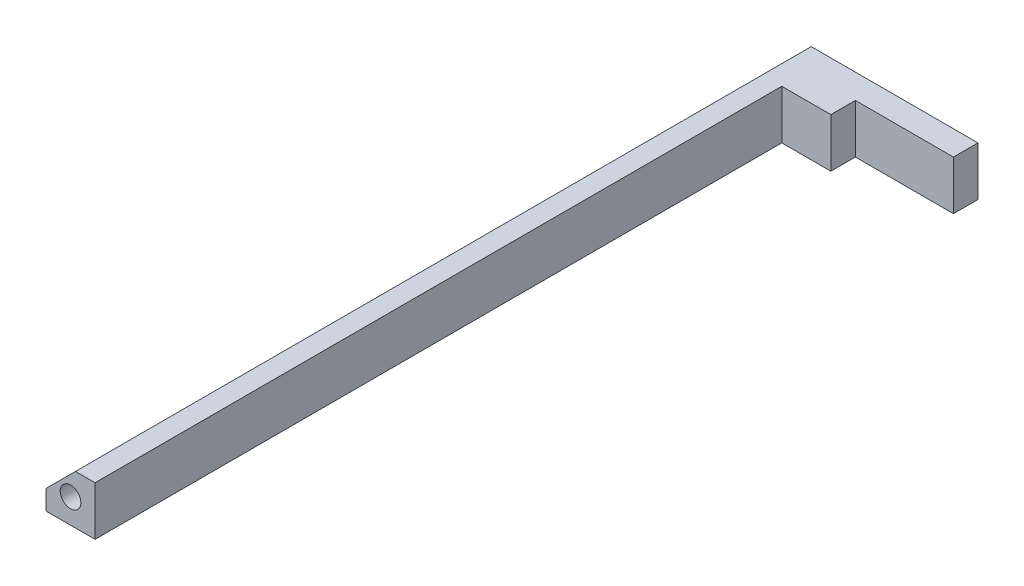
ISO-10303-21;
HEADER;
FILE_DESCRIPTION(('STEP AP214'),'2;1');
FILE_NAME('part.step','',(''),(''),'','','');
FILE_SCHEMA(('AUTOMOTIVE_DESIGN { 1 0 10303 214 1 1 1 1 }'));
ENDSEC;
DATA;
#1=APPLICATION_CONTEXT('core data for automotive mechanical design processes');
#2=APPLICATION_PROTOCOL_DEFINITION('international standard','automotive_design',2000,#1);
#3=PRODUCT_CONTEXT('',#1,'mechanical');
#4=PRODUCT('Part','Part','',(#3));
#5=PRODUCT_RELATED_PRODUCT_CATEGORY('part','',(#4));
#6=PRODUCT_DEFINITION_FORMATION('','',#4);
#7=PRODUCT_DEFINITION_CONTEXT('part definition',#1,'design');
#8=PRODUCT_DEFINITION('design','',#6,#7);
#9=PRODUCT_DEFINITION_SHAPE('','',#8);
#10=(LENGTH_UNIT() NAMED_UNIT(*) SI_UNIT(.MILLI.,.METRE.));
#11=(NAMED_UNIT(*) PLANE_ANGLE_UNIT() SI_UNIT($,.RADIAN.));
#12=(NAMED_UNIT(*) SI_UNIT($,.STERADIAN.) SOLID_ANGLE_UNIT());
#13=UNCERTAINTY_MEASURE_WITH_UNIT(LENGTH_MEASURE(1.E-05),#10,'distance_accuracy_value','');
#14=(GEOMETRIC_REPRESENTATION_CONTEXT(3) GLOBAL_UNCERTAINTY_ASSIGNED_CONTEXT((#13)) GLOBAL_UNIT_ASSIGNED_CONTEXT((#10,
#11,#12)) REPRESENTATION_CONTEXT('',''));
#15=CARTESIAN_POINT('',(0.,0.,0.));
#16=DIRECTION('',(0.,0.,1.));
#17=DIRECTION('',(1.,0.,0.));
#18=AXIS2_PLACEMENT_3D('',#15,#16,#17);
#19=CARTESIAN_POINT('',(10.,10.,0.));
#20=DIRECTION('',(0.,0.,-1.));
#21=DIRECTION('',(-1.,0.,0.));
#22=AXIS2_PLACEMENT_3D('',#19,#20,#21);
#23=PLANE('',#22);
#24=CARTESIAN_POINT('',(5.,5.,0.));
#25=DIRECTION('',(0.,0.,1.));
#26=DIRECTION('',(1.,0.,0.));
#27=AXIS2_PLACEMENT_3D('',#24,#25,#26);
#28=CIRCLE('',#27,2.1);
#29=CARTESIAN_POINT('',(7.1,5.,0.));
#30=VERTEX_POINT('',#29);
#31=EDGE_CURVE('E192',#30,#30,#28,.T.);
#32=ORIENTED_EDGE('',*,*,#31,.F.);
#33=EDGE_LOOP('',(#32));
#34=FACE_BOUND('',#33,.T.);
#35=DIRECTION('',(1.,0.,0.));
#36=VECTOR('',#35,1.);
#37=CARTESIAN_POINT('',(10.,10.,0.));
#38=LINE('',#37,#36);
#39=CARTESIAN_POINT('',(6.00000000000001,10.,0.));
#40=VERTEX_POINT('',#39);
#41=CARTESIAN_POINT('',(10.,10.,0.));
#42=VERTEX_POINT('',#41);
#43=EDGE_CURVE('E110',#40,#42,#38,.T.);
#44=ORIENTED_EDGE('',*,*,#43,.F.);
#45=DIRECTION('',(0.707106781186546,0.707106781186549,0.));
#46=VECTOR('',#45,1.);
#47=CARTESIAN_POINT('',(6.00000000000001,10.,0.));
#48=LINE('',#47,#46);
#49=CARTESIAN_POINT('',(0.,3.99999999999997,0.));
#50=VERTEX_POINT('',#49);
#51=EDGE_CURVE('E64',#40,#50,#48,.F.);
#52=ORIENTED_EDGE('',*,*,#51,.T.);
#53=DIRECTION('',(0.,-1.,0.));
#54=VECTOR('',#53,1.);
#55=CARTESIAN_POINT('',(0.,10.,0.));
#56=LINE('',#55,#54);
#57=CARTESIAN_POINT('',(0.,0.,0.));
#58=VERTEX_POINT('',#57);
#59=EDGE_CURVE('E152',#50,#58,#56,.T.);
#60=ORIENTED_EDGE('',*,*,#59,.T.);
#61=DIRECTION('',(1.,0.,0.));
#62=VECTOR('',#61,1.);
#63=CARTESIAN_POINT('',(10.,0.,0.));
#64=LINE('',#63,#62);
#65=CARTESIAN_POINT('',(10.,0.,0.));
#66=VERTEX_POINT('',#65);
#67=EDGE_CURVE('E132',#58,#66,#64,.T.);
#68=ORIENTED_EDGE('',*,*,#67,.T.);
#69=DIRECTION('',(0.,-1.,0.));
#70=VECTOR('',#69,1.);
#71=CARTESIAN_POINT('',(10.,10.,0.));
#72=LINE('',#71,#70);
#73=EDGE_CURVE('E124',#42,#66,#72,.T.);
#74=ORIENTED_EDGE('',*,*,#73,.F.);
#75=EDGE_LOOP('',(#44,#52,#60,#68,#74));
#76=FACE_BOUND('',#75,.T.);
#77=ADVANCED_FACE('F41',(#34,#76),#23,.F.);
#78=CARTESIAN_POINT('',(9.99999999999998,10.,-140.));
#79=DIRECTION('',(-1.,0.,0.));
#80=DIRECTION('',(0.,0.,1.));
#81=AXIS2_PLACEMENT_3D('',#78,#79,#80);
#82=PLANE('',#81);
#83=DIRECTION('',(0.,0.,-1.));
#84=VECTOR('',#83,1.);
#85=CARTESIAN_POINT('',(9.99999999999998,0.,-140.));
#86=LINE('',#85,#84);
#87=CARTESIAN_POINT('',(9.99999999999998,0.,-140.));
#88=VERTEX_POINT('',#87);
#89=EDGE_CURVE('E168',#66,#88,#86,.T.);
#90=ORIENTED_EDGE('',*,*,#89,.T.);
#91=DIRECTION('',(0.,-1.,0.));
#92=VECTOR('',#91,1.);
#93=CARTESIAN_POINT('',(9.99999999999998,10.,-140.));
#94=LINE('',#93,#92);
#95=CARTESIAN_POINT('',(9.99999999999998,10.,-140.));
#96=VERTEX_POINT('',#95);
#97=EDGE_CURVE('E127',#96,#88,#94,.T.);
#98=ORIENTED_EDGE('',*,*,#97,.F.);
#99=DIRECTION('',(0.,0.,-1.));
#100=VECTOR('',#99,1.);
#101=CARTESIAN_POINT('',(9.99999999999998,10.,-140.));
#102=LINE('',#101,#100);
#103=EDGE_CURVE('E114',#42,#96,#102,.T.);
#104=ORIENTED_EDGE('',*,*,#103,.F.);
#105=ORIENTED_EDGE('',*,*,#73,.T.);
#106=EDGE_LOOP('',(#90,#98,#104,#105));
#107=FACE_BOUND('',#106,.T.);
#108=ADVANCED_FACE('F123',(#107),#82,.F.);
#109=CARTESIAN_POINT('',(20.,10.,-140.));
#110=DIRECTION('',(0.,0.,-1.));
#111=DIRECTION('',(-1.,0.,0.));
#112=AXIS2_PLACEMENT_3D('',#109,#110,#111);
#113=PLANE('',#112);
#114=DIRECTION('',(1.,0.,0.));
#115=VECTOR('',#114,1.);
#116=CARTESIAN_POINT('',(20.,0.,-140.));
#117=LINE('',#116,#115);
#118=CARTESIAN_POINT('',(20.,0.,-140.));
#119=VERTEX_POINT('',#118);
#120=EDGE_CURVE('E166',#88,#119,#117,.T.);
#121=ORIENTED_EDGE('',*,*,#120,.T.);
#122=DIRECTION('',(0.,-1.,0.));
#123=VECTOR('',#122,1.);
#124=CARTESIAN_POINT('',(20.,10.,-140.));
#125=LINE('',#124,#123);
#126=CARTESIAN_POINT('',(20.,10.,-140.));
#127=VERTEX_POINT('',#126);
#128=EDGE_CURVE('E135',#127,#119,#125,.T.);
#129=ORIENTED_EDGE('',*,*,#128,.F.);
#130=DIRECTION('',(1.,0.,0.));
#131=VECTOR('',#130,1.);
#132=CARTESIAN_POINT('',(20.,10.,-140.));
#133=LINE('',#132,#131);
#134=EDGE_CURVE('E129',#96,#127,#133,.T.);
#135=ORIENTED_EDGE('',*,*,#134,.F.);
#136=ORIENTED_EDGE('',*,*,#97,.T.);
#137=EDGE_LOOP('',(#121,#129,#135,#136));
#138=FACE_BOUND('',#137,.T.);
#139=ADVANCED_FACE('F211',(#138),#113,.F.);
#140=CARTESIAN_POINT('',(20.,10.,-145.));
#141=DIRECTION('',(-1.,0.,0.));
#142=DIRECTION('',(0.,0.,1.));
#143=AXIS2_PLACEMENT_3D('',#140,#141,#142);
#144=PLANE('',#143);
#145=DIRECTION('',(0.,0.,-1.));
#146=VECTOR('',#145,1.);
#147=CARTESIAN_POINT('',(20.,0.,-145.));
#148=LINE('',#147,#146);
#149=CARTESIAN_POINT('',(20.,0.,-145.));
#150=VERTEX_POINT('',#149);
#151=EDGE_CURVE('E164',#119,#150,#148,.T.);
#152=ORIENTED_EDGE('',*,*,#151,.T.);
#153=DIRECTION('',(0.,-1.,0.));
#154=VECTOR('',#153,1.);
#155=CARTESIAN_POINT('',(20.,10.,-145.));
#156=LINE('',#155,#154);
#157=CARTESIAN_POINT('',(20.,10.,-145.));
#158=VERTEX_POINT('',#157);
#159=EDGE_CURVE('E141',#158,#150,#156,.T.);
#160=ORIENTED_EDGE('',*,*,#159,.F.);
#161=DIRECTION('',(0.,0.,-1.));
#162=VECTOR('',#161,1.);
#163=CARTESIAN_POINT('',(20.,10.,-145.));
#164=LINE('',#163,#162);
#165=EDGE_CURVE('E177',#127,#158,#164,.T.);
#166=ORIENTED_EDGE('',*,*,#165,.F.);
#167=ORIENTED_EDGE('',*,*,#128,.T.);
#168=EDGE_LOOP('',(#152,#160,#166,#167));
#169=FACE_BOUND('',#168,.T.);
#170=ADVANCED_FACE('F216',(#169),#144,.F.);
#171=CARTESIAN_POINT('',(40.,10.,-145.));
#172=DIRECTION('',(0.,0.,-1.));
#173=DIRECTION('',(-1.,0.,0.));
#174=AXIS2_PLACEMENT_3D('',#171,#172,#173);
#175=PLANE('',#174);
#176=DIRECTION('',(1.,0.,0.));
#177=VECTOR('',#176,1.);
#178=CARTESIAN_POINT('',(40.,0.,-145.));
#179=LINE('',#178,#177);
#180=CARTESIAN_POINT('',(40.,0.,-145.));
#181=VERTEX_POINT('',#180);
#182=EDGE_CURVE('E162',#150,#181,#179,.T.);
#183=ORIENTED_EDGE('',*,*,#182,.T.);
#184=DIRECTION('',(0.,-1.,0.));
#185=VECTOR('',#184,1.);
#186=CARTESIAN_POINT('',(40.,10.,-145.));
#187=LINE('',#186,#185);
#188=CARTESIAN_POINT('',(40.,10.,-145.));
#189=VERTEX_POINT('',#188);
#190=EDGE_CURVE('E144',#189,#181,#187,.T.);
#191=ORIENTED_EDGE('',*,*,#190,.F.);
#192=DIRECTION('',(1.,0.,0.));
#193=VECTOR('',#192,1.);
#194=CARTESIAN_POINT('',(40.,10.,-145.));
#195=LINE('',#194,#193);
#196=EDGE_CURVE('E175',#158,#189,#195,.T.);
#197=ORIENTED_EDGE('',*,*,#196,.F.);
#198=ORIENTED_EDGE('',*,*,#159,.T.);
#199=EDGE_LOOP('',(#183,#191,#197,#198));
#200=FACE_BOUND('',#199,.T.);
#201=ADVANCED_FACE('F220',(#200),#175,.F.);
#202=CARTESIAN_POINT('',(40.,10.,-150.));
#203=DIRECTION('',(-1.,0.,0.));
#204=DIRECTION('',(0.,0.,1.));
#205=AXIS2_PLACEMENT_3D('',#202,#203,#204);
#206=PLANE('',#205);
#207=DIRECTION('',(0.,0.,-1.));
#208=VECTOR('',#207,1.);
#209=CARTESIAN_POINT('',(40.,0.,-150.));
#210=LINE('',#209,#208);
#211=CARTESIAN_POINT('',(40.,0.,-150.));
#212=VERTEX_POINT('',#211);
#213=EDGE_CURVE('E160',#181,#212,#210,.T.);
#214=ORIENTED_EDGE('',*,*,#213,.T.);
#215=DIRECTION('',(0.,-1.,0.));
#216=VECTOR('',#215,1.);
#217=CARTESIAN_POINT('',(40.,10.,-150.));
#218=LINE('',#217,#216);
#219=CARTESIAN_POINT('',(40.,10.,-150.));
#220=VERTEX_POINT('',#219);
#221=EDGE_CURVE('E147',#220,#212,#218,.T.);
#222=ORIENTED_EDGE('',*,*,#221,.F.);
#223=DIRECTION('',(0.,0.,-1.));
#224=VECTOR('',#223,1.);
#225=CARTESIAN_POINT('',(40.,10.,-150.));
#226=LINE('',#225,#224);
#227=EDGE_CURVE('E173',#189,#220,#226,.T.);
#228=ORIENTED_EDGE('',*,*,#227,.F.);
#229=ORIENTED_EDGE('',*,*,#190,.T.);
#230=EDGE_LOOP('',(#214,#222,#228,#229));
#231=FACE_BOUND('',#230,.T.);
#232=ADVANCED_FACE('F224',(#231),#206,.F.);
#233=CARTESIAN_POINT('',(0.,10.,-150.));
#234=DIRECTION('',(0.,0.,1.));
#235=DIRECTION('',(1.,0.,0.));
#236=AXIS2_PLACEMENT_3D('',#233,#234,#235);
#237=PLANE('',#236);
#238=DIRECTION('',(0.,-1.,0.));
#239=VECTOR('',#238,1.);
#240=CARTESIAN_POINT('',(0.,10.,-150.));
#241=LINE('',#240,#239);
#242=CARTESIAN_POINT('',(0.,3.99999999999997,-150.));
#243=VERTEX_POINT('',#242);
#244=CARTESIAN_POINT('',(0.,0.,-150.));
#245=VERTEX_POINT('',#244);
#246=EDGE_CURVE('E150',#243,#245,#241,.T.);
#247=ORIENTED_EDGE('',*,*,#246,.F.);
#248=DIRECTION('',(-0.707106781186546,-0.707106781186549,0.));
#249=VECTOR('',#248,1.);
#250=CARTESIAN_POINT('',(6.00000000000001,10.,-150.));
#251=LINE('',#250,#249);
#252=CARTESIAN_POINT('',(6.00000000000001,10.,-150.));
#253=VERTEX_POINT('',#252);
#254=EDGE_CURVE('E11',#243,#253,#251,.F.);
#255=ORIENTED_EDGE('',*,*,#254,.T.);
#256=DIRECTION('',(-1.,0.,0.));
#257=VECTOR('',#256,1.);
#258=CARTESIAN_POINT('',(0.,10.,-150.));
#259=LINE('',#258,#257);
#260=EDGE_CURVE('E154',#220,#253,#259,.T.);
#261=ORIENTED_EDGE('',*,*,#260,.F.);
#262=ORIENTED_EDGE('',*,*,#221,.T.);
#263=DIRECTION('',(-1.,0.,0.));
#264=VECTOR('',#263,1.);
#265=CARTESIAN_POINT('',(0.,0.,-150.));
#266=LINE('',#265,#264);
#267=EDGE_CURVE('E157',#212,#245,#266,.T.);
#268=ORIENTED_EDGE('',*,*,#267,.T.);
#269=EDGE_LOOP('',(#247,#255,#261,#262,#268));
#270=FACE_BOUND('',#269,.T.);
#271=ADVANCED_FACE('F228',(#270),#237,.F.);
#272=CARTESIAN_POINT('',(0.,10.,0.));
#273=DIRECTION('',(1.,0.,0.));
#274=DIRECTION('',(0.,0.,-1.));
#275=AXIS2_PLACEMENT_3D('',#272,#273,#274);
#276=PLANE('',#275);
#277=ORIENTED_EDGE('',*,*,#59,.F.);
#278=DIRECTION('',(0.,0.,-1.));
#279=VECTOR('',#278,1.);
#280=CARTESIAN_POINT('',(0.,3.99999999999997,0.));
#281=LINE('',#280,#279);
#282=EDGE_CURVE('E50',#50,#243,#281,.T.);
#283=ORIENTED_EDGE('',*,*,#282,.T.);
#284=ORIENTED_EDGE('',*,*,#246,.T.);
#285=DIRECTION('',(0.,0.,1.));
#286=VECTOR('',#285,1.);
#287=CARTESIAN_POINT('',(0.,0.,0.));
#288=LINE('',#287,#286);
#289=EDGE_CURVE('E119',#245,#58,#288,.T.);
#290=ORIENTED_EDGE('',*,*,#289,.T.);
#291=EDGE_LOOP('',(#277,#283,#284,#290));
#292=FACE_BOUND('',#291,.T.);
#293=ADVANCED_FACE('F232',(#292),#276,.F.);
#294=CARTESIAN_POINT('',(0.,10.,0.));
#295=DIRECTION('',(0.,-1.,0.));
#296=DIRECTION('',(0.,0.,-1.));
#297=AXIS2_PLACEMENT_3D('',#294,#295,#296);
#298=PLANE('',#297);
#299=ORIENTED_EDGE('',*,*,#260,.T.);
#300=DIRECTION('',(0.,0.,1.));
#301=VECTOR('',#300,1.);
#302=CARTESIAN_POINT('',(6.00000000000001,10.,0.));
#303=LINE('',#302,#301);
#304=EDGE_CURVE('E117',#253,#40,#303,.T.);
#305=ORIENTED_EDGE('',*,*,#304,.T.);
#306=ORIENTED_EDGE('',*,*,#43,.T.);
#307=ORIENTED_EDGE('',*,*,#103,.T.);
#308=ORIENTED_EDGE('',*,*,#134,.T.);
#309=ORIENTED_EDGE('',*,*,#165,.T.);
#310=ORIENTED_EDGE('',*,*,#196,.T.);
#311=ORIENTED_EDGE('',*,*,#227,.T.);
#312=EDGE_LOOP('',(#299,#305,#306,#307,#308,#309,#310,#311));
#313=FACE_BOUND('',#312,.T.);
#314=ADVANCED_FACE('F113',(#313),#298,.F.);
#315=CARTESIAN_POINT('',(0.,0.,0.));
#316=DIRECTION('',(0.,-1.,0.));
#317=DIRECTION('',(0.,0.,-1.));
#318=AXIS2_PLACEMENT_3D('',#315,#316,#317);
#319=PLANE('',#318);
#320=CARTESIAN_POINT('',(7.2,0.,-27.));
#321=DIRECTION('',(0.,-1.,0.));
#322=DIRECTION('',(0.,0.,-1.));
#323=AXIS2_PLACEMENT_3D('',#320,#321,#322);
#324=CIRCLE('',#323,2.1);
#325=CARTESIAN_POINT('',(7.2,0.,-29.1));
#326=VERTEX_POINT('',#325);
#327=EDGE_CURVE('E187',#326,#326,#324,.T.);
#328=ORIENTED_EDGE('',*,*,#327,.F.);
#329=EDGE_LOOP('',(#328));
#330=FACE_BOUND('',#329,.T.);
#331=CARTESIAN_POINT('',(7.20000000000002,0.,-123.));
#332=DIRECTION('',(0.,-1.,0.));
#333=DIRECTION('',(0.,0.,-1.));
#334=AXIS2_PLACEMENT_3D('',#331,#332,#333);
#335=CIRCLE('',#334,2.1);
#336=CARTESIAN_POINT('',(7.20000000000002,0.,-125.1));
#337=VERTEX_POINT('',#336);
#338=EDGE_CURVE('E180',#337,#337,#335,.T.);
#339=ORIENTED_EDGE('',*,*,#338,.F.);
#340=EDGE_LOOP('',(#339));
#341=FACE_BOUND('',#340,.T.);
#342=ORIENTED_EDGE('',*,*,#67,.F.);
#343=ORIENTED_EDGE('',*,*,#289,.F.);
#344=ORIENTED_EDGE('',*,*,#267,.F.);
#345=ORIENTED_EDGE('',*,*,#213,.F.);
#346=ORIENTED_EDGE('',*,*,#182,.F.);
#347=ORIENTED_EDGE('',*,*,#151,.F.);
#348=ORIENTED_EDGE('',*,*,#120,.F.);
#349=ORIENTED_EDGE('',*,*,#89,.F.);
#350=EDGE_LOOP('',(#342,#343,#344,#345,#346,#347,#348,#349));
#351=FACE_BOUND('',#350,.T.);
#352=ADVANCED_FACE('F236',(#330,#341,#351),#319,.T.);
#353=CARTESIAN_POINT('',(7.20000000000002,4.,-123.));
#354=DIRECTION('',(0.,-1.,0.));
#355=DIRECTION('',(0.,0.,-1.));
#356=AXIS2_PLACEMENT_3D('',#353,#354,#355);
#357=CYLINDRICAL_SURFACE('',#356,2.1);
#358=CARTESIAN_POINT('',(7.20000000000002,4.,-123.));
#359=DIRECTION('',(0.,-1.,0.));
#360=DIRECTION('',(0.,0.,-1.));
#361=AXIS2_PLACEMENT_3D('',#358,#359,#360);
#362=CIRCLE('',#361,2.1);
#363=CARTESIAN_POINT('',(7.20000000000002,4.,-125.1));
#364=VERTEX_POINT('',#363);
#365=EDGE_CURVE('E183',#364,#364,#362,.T.);
#366=ORIENTED_EDGE('',*,*,#365,.F.);
#367=EDGE_LOOP('',(#366));
#368=FACE_BOUND('',#367,.T.);
#369=ORIENTED_EDGE('',*,*,#338,.T.);
#370=EDGE_LOOP('',(#369));
#371=FACE_BOUND('',#370,.T.);
#372=ADVANCED_FACE('F239',(#368,#371),#357,.F.);
#373=CARTESIAN_POINT('',(7.20000000000002,4.,-123.));
#374=DIRECTION('',(0.,-1.,0.));
#375=DIRECTION('',(0.,0.,-1.));
#376=AXIS2_PLACEMENT_3D('',#373,#374,#375);
#377=PLANE('',#376);
#378=ORIENTED_EDGE('',*,*,#365,.T.);
#379=EDGE_LOOP('',(#378));
#380=FACE_BOUND('',#379,.T.);
#381=ADVANCED_FACE('F245',(#380),#377,.T.);
#382=CARTESIAN_POINT('',(7.2,4.,-27.));
#383=DIRECTION('',(0.,-1.,0.));
#384=DIRECTION('',(0.,0.,-1.));
#385=AXIS2_PLACEMENT_3D('',#382,#383,#384);
#386=CYLINDRICAL_SURFACE('',#385,2.1);
#387=CARTESIAN_POINT('',(7.2,4.,-27.));
#388=DIRECTION('',(0.,-1.,0.));
#389=DIRECTION('',(0.,0.,-1.));
#390=AXIS2_PLACEMENT_3D('',#387,#388,#389);
#391=CIRCLE('',#390,2.1);
#392=CARTESIAN_POINT('',(7.2,4.,-29.1));
#393=VERTEX_POINT('',#392);
#394=EDGE_CURVE('E171',#393,#393,#391,.T.);
#395=ORIENTED_EDGE('',*,*,#394,.F.);
#396=EDGE_LOOP('',(#395));
#397=FACE_BOUND('',#396,.T.);
#398=ORIENTED_EDGE('',*,*,#327,.T.);
#399=EDGE_LOOP('',(#398));
#400=FACE_BOUND('',#399,.T.);
#401=ADVANCED_FACE('F249',(#397,#400),#386,.F.);
#402=CARTESIAN_POINT('',(7.2,4.,-27.));
#403=DIRECTION('',(0.,-1.,0.));
#404=DIRECTION('',(0.,0.,-1.));
#405=AXIS2_PLACEMENT_3D('',#402,#403,#404);
#406=PLANE('',#405);
#407=ORIENTED_EDGE('',*,*,#394,.T.);
#408=EDGE_LOOP('',(#407));
#409=FACE_BOUND('',#408,.T.);
#410=ADVANCED_FACE('F203',(#409),#406,.T.);
#411=CARTESIAN_POINT('',(5.,5.,-4.));
#412=DIRECTION('',(0.,0.,1.));
#413=DIRECTION('',(1.,0.,0.));
#414=AXIS2_PLACEMENT_3D('',#411,#412,#413);
#415=CYLINDRICAL_SURFACE('',#414,2.1);
#416=CARTESIAN_POINT('',(5.,5.,-4.));
#417=DIRECTION('',(0.,0.,1.));
#418=DIRECTION('',(1.,0.,0.));
#419=AXIS2_PLACEMENT_3D('',#416,#417,#418);
#420=CIRCLE('',#419,2.1);
#421=CARTESIAN_POINT('',(7.1,5.,-4.));
#422=VERTEX_POINT('',#421);
#423=EDGE_CURVE('E184',#422,#422,#420,.T.);
#424=ORIENTED_EDGE('',*,*,#423,.F.);
#425=EDGE_LOOP('',(#424));
#426=FACE_BOUND('',#425,.T.);
#427=ORIENTED_EDGE('',*,*,#31,.T.);
#428=EDGE_LOOP('',(#427));
#429=FACE_BOUND('',#428,.T.);
#430=ADVANCED_FACE('F200',(#426,#429),#415,.F.);
#431=CARTESIAN_POINT('',(5.,5.,-4.));
#432=DIRECTION('',(0.,0.,1.));
#433=DIRECTION('',(1.,0.,0.));
#434=AXIS2_PLACEMENT_3D('',#431,#432,#433);
#435=PLANE('',#434);
#436=ORIENTED_EDGE('',*,*,#423,.T.);
#437=EDGE_LOOP('',(#436));
#438=FACE_BOUND('',#437,.T.);
#439=ADVANCED_FACE('F198',(#438),#435,.T.);
#440=CARTESIAN_POINT('',(6.00000000000001,10.,0.));
#441=DIRECTION('',(0.707106781186549,-0.707106781186546,0.));
#442=DIRECTION('',(0.,0.,1.));
#443=AXIS2_PLACEMENT_3D('',#440,#441,#442);
#444=PLANE('',#443);
#445=ORIENTED_EDGE('',*,*,#254,.F.);
#446=ORIENTED_EDGE('',*,*,#282,.F.);
#447=ORIENTED_EDGE('',*,*,#51,.F.);
#448=ORIENTED_EDGE('',*,*,#304,.F.);
#449=EDGE_LOOP('',(#445,#446,#447,#448));
#450=FACE_BOUND('',#449,.T.);
#451=ADVANCED_FACE('F44',(#450),#444,.F.);
#452=CLOSED_SHELL('',(#77,#108,#139,#170,#201,#232,#271,#293,#314,#352,#372,#381,#401,#410,#430,
#439,#451));
#453=MANIFOLD_SOLID_BREP('B2',#452);
#454=ADVANCED_BREP_SHAPE_REPRESENTATION('',(#18,#453),#14);
#455=SHAPE_DEFINITION_REPRESENTATION(#9,#454);
ENDSEC;
END-ISO-10303-21;
